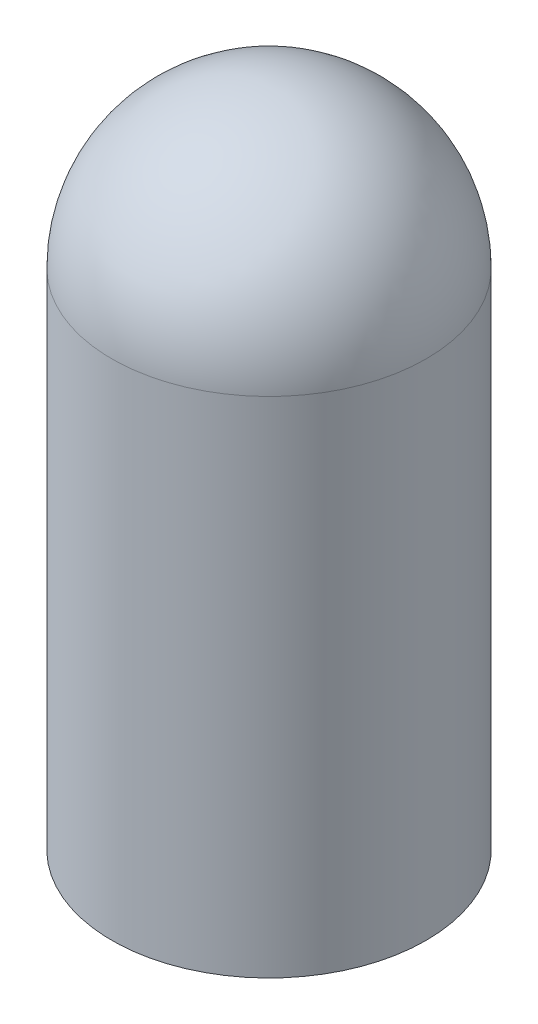
ISO-10303-21;
HEADER;
FILE_DESCRIPTION(('STEP AP214'),'2;1');
FILE_NAME('part.step','',(''),(''),'','','');
FILE_SCHEMA(('AUTOMOTIVE_DESIGN { 1 0 10303 214 1 1 1 1 }'));
ENDSEC;
DATA;
#1=APPLICATION_CONTEXT('core data for automotive mechanical design processes');
#2=APPLICATION_PROTOCOL_DEFINITION('international standard','automotive_design',2000,#1);
#3=PRODUCT_CONTEXT('',#1,'mechanical');
#4=PRODUCT('Part','Part','',(#3));
#5=PRODUCT_RELATED_PRODUCT_CATEGORY('part','',(#4));
#6=PRODUCT_DEFINITION_FORMATION('','',#4);
#7=PRODUCT_DEFINITION_CONTEXT('part definition',#1,'design');
#8=PRODUCT_DEFINITION('design','',#6,#7);
#9=PRODUCT_DEFINITION_SHAPE('','',#8);
#10=(LENGTH_UNIT() NAMED_UNIT(*) SI_UNIT(.MILLI.,.METRE.));
#11=(NAMED_UNIT(*) PLANE_ANGLE_UNIT() SI_UNIT($,.RADIAN.));
#12=(NAMED_UNIT(*) SI_UNIT($,.STERADIAN.) SOLID_ANGLE_UNIT());
#13=UNCERTAINTY_MEASURE_WITH_UNIT(LENGTH_MEASURE(1.E-05),#10,'distance_accuracy_value','');
#14=(GEOMETRIC_REPRESENTATION_CONTEXT(3) GLOBAL_UNCERTAINTY_ASSIGNED_CONTEXT((#13)) GLOBAL_UNIT_ASSIGNED_CONTEXT((#10,
#11,#12)) REPRESENTATION_CONTEXT('',''));
#15=CARTESIAN_POINT('',(0.,0.,0.));
#16=DIRECTION('',(0.,0.,1.));
#17=DIRECTION('',(1.,0.,0.));
#18=AXIS2_PLACEMENT_3D('',#15,#16,#17);
#19=CARTESIAN_POINT('',(0.,0.,0.));
#20=DIRECTION('',(0.,1.,0.));
#21=DIRECTION('',(-1.,0.,0.));
#22=AXIS2_PLACEMENT_3D('',#19,#20,#21);
#23=PLANE('',#22);
#24=CARTESIAN_POINT('',(0.,0.,0.));
#25=DIRECTION('',(0.,1.,0.));
#26=DIRECTION('',(-1.,0.,0.));
#27=AXIS2_PLACEMENT_3D('',#24,#25,#26);
#28=CIRCLE('',#27,9.25);
#29=CARTESIAN_POINT('',(-9.25,0.,0.));
#30=VERTEX_POINT('',#29);
#31=EDGE_CURVE('E41',#30,#30,#28,.T.);
#32=ORIENTED_EDGE('',*,*,#31,.T.);
#33=EDGE_LOOP('',(#32));
#34=FACE_BOUND('',#33,.T.);
#35=CARTESIAN_POINT('',(0.,0.,0.));
#36=DIRECTION('',(0.,1.,0.));
#37=DIRECTION('',(-1.,0.,0.));
#38=AXIS2_PLACEMENT_3D('',#35,#36,#37);
#39=CIRCLE('',#38,9.75);
#40=CARTESIAN_POINT('',(-9.75,0.,0.));
#41=VERTEX_POINT('',#40);
#42=EDGE_CURVE('E10',#41,#41,#39,.T.);
#43=ORIENTED_EDGE('',*,*,#42,.F.);
#44=EDGE_LOOP('',(#43));
#45=FACE_BOUND('',#44,.T.);
#46=ADVANCED_FACE('F31',(#34,#45),#23,.F.);
#47=CARTESIAN_POINT('',(0.,41.,0.));
#48=DIRECTION('',(0.,1.,0.));
#49=DIRECTION('',(-1.,0.,0.));
#50=AXIS2_PLACEMENT_3D('',#47,#48,#49);
#51=CYLINDRICAL_SURFACE('',#50,9.75);
#52=CARTESIAN_POINT('',(0.,31.25,0.));
#53=DIRECTION('',(0.,1.,0.));
#54=DIRECTION('',(-1.,0.,0.));
#55=AXIS2_PLACEMENT_3D('',#52,#53,#54);
#56=CIRCLE('',#55,9.75);
#57=CARTESIAN_POINT('',(-9.75,31.25,0.));
#58=VERTEX_POINT('',#57);
#59=EDGE_CURVE('E37',#58,#58,#56,.T.);
#60=ORIENTED_EDGE('',*,*,#59,.F.);
#61=EDGE_LOOP('',(#60));
#62=FACE_BOUND('',#61,.T.);
#63=ORIENTED_EDGE('',*,*,#42,.T.);
#64=EDGE_LOOP('',(#63));
#65=FACE_BOUND('',#64,.T.);
#66=ADVANCED_FACE('F64',(#62,#65),#51,.T.);
#67=CARTESIAN_POINT('',(0.,31.25,0.));
#68=DIRECTION('',(0.,1.,0.));
#69=DIRECTION('',(1.,0.,0.));
#70=AXIS2_PLACEMENT_3D('',#67,#68,#69);
#71=SPHERICAL_SURFACE('',#70,9.75);
#72=ORIENTED_EDGE('',*,*,#59,.T.);
#73=EDGE_LOOP('',(#72));
#74=FACE_BOUND('',#73,.T.);
#75=ADVANCED_FACE('F60',(#74),#71,.T.);
#76=CARTESIAN_POINT('',(0.,41.,0.));
#77=DIRECTION('',(0.,1.,0.));
#78=DIRECTION('',(-1.,0.,0.));
#79=AXIS2_PLACEMENT_3D('',#76,#77,#78);
#80=CYLINDRICAL_SURFACE('',#79,9.25);
#81=CARTESIAN_POINT('',(0.,31.25,0.));
#82=DIRECTION('',(0.,1.,0.));
#83=DIRECTION('',(-1.,0.,0.));
#84=AXIS2_PLACEMENT_3D('',#81,#82,#83);
#85=CIRCLE('',#84,9.25);
#86=CARTESIAN_POINT('',(-9.25,31.25,0.));
#87=VERTEX_POINT('',#86);
#88=EDGE_CURVE('E45',#87,#87,#85,.T.);
#89=ORIENTED_EDGE('',*,*,#88,.T.);
#90=EDGE_LOOP('',(#89));
#91=FACE_BOUND('',#90,.T.);
#92=ORIENTED_EDGE('',*,*,#31,.F.);
#93=EDGE_LOOP('',(#92));
#94=FACE_BOUND('',#93,.T.);
#95=ADVANCED_FACE('F51',(#91,#94),#80,.F.);
#96=CARTESIAN_POINT('',(0.,31.25,0.));
#97=DIRECTION('',(0.,1.,0.));
#98=DIRECTION('',(1.,0.,0.));
#99=AXIS2_PLACEMENT_3D('',#96,#97,#98);
#100=SPHERICAL_SURFACE('',#99,9.25);
#101=ORIENTED_EDGE('',*,*,#88,.F.);
#102=EDGE_LOOP('',(#101));
#103=FACE_BOUND('',#102,.T.);
#104=ADVANCED_FACE('F54',(#103),#100,.F.);
#105=CLOSED_SHELL('',(#46,#66,#75,#95,#104));
#106=MANIFOLD_SOLID_BREP('B2',#105);
#107=ADVANCED_BREP_SHAPE_REPRESENTATION('',(#18,#106),#14);
#108=SHAPE_DEFINITION_REPRESENTATION(#9,#107);
ENDSEC;
END-ISO-10303-21;
